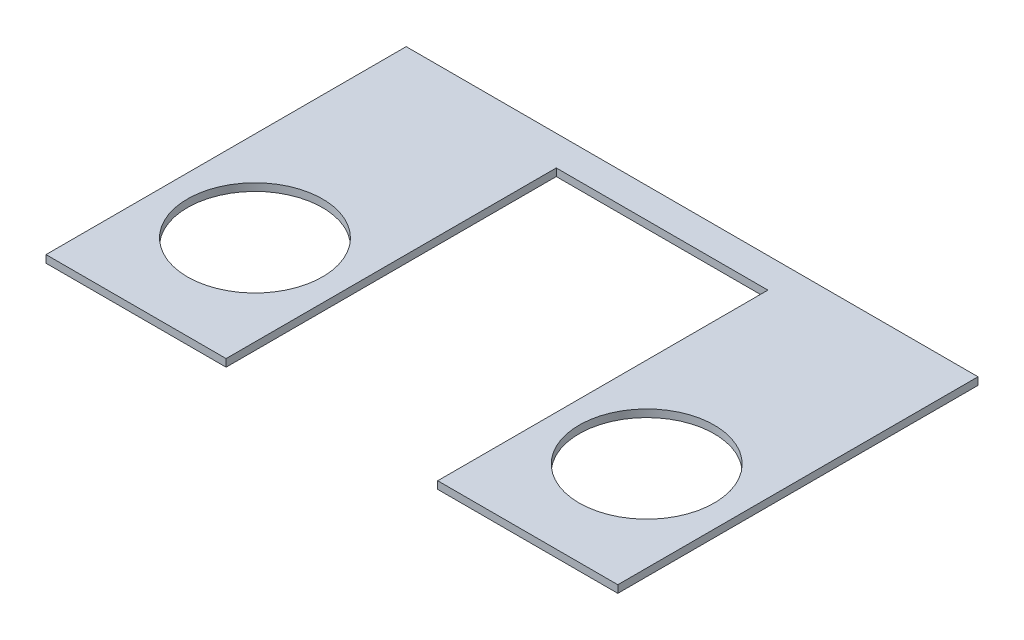
ISO-10303-21;
HEADER;
FILE_DESCRIPTION(('STEP AP214'),'2;1');
FILE_NAME('part.step','',(''),(''),'','','');
FILE_SCHEMA(('AUTOMOTIVE_DESIGN { 1 0 10303 214 1 1 1 1 }'));
ENDSEC;
DATA;
#1=APPLICATION_CONTEXT('core data for automotive mechanical design processes');
#2=APPLICATION_PROTOCOL_DEFINITION('international standard','automotive_design',2000,#1);
#3=PRODUCT_CONTEXT('',#1,'mechanical');
#4=PRODUCT('Part','Part','',(#3));
#5=PRODUCT_RELATED_PRODUCT_CATEGORY('part','',(#4));
#6=PRODUCT_DEFINITION_FORMATION('','',#4);
#7=PRODUCT_DEFINITION_CONTEXT('part definition',#1,'design');
#8=PRODUCT_DEFINITION('design','',#6,#7);
#9=PRODUCT_DEFINITION_SHAPE('','',#8);
#10=(LENGTH_UNIT() NAMED_UNIT(*) SI_UNIT(.MILLI.,.METRE.));
#11=(NAMED_UNIT(*) PLANE_ANGLE_UNIT() SI_UNIT($,.RADIAN.));
#12=(NAMED_UNIT(*) SI_UNIT($,.STERADIAN.) SOLID_ANGLE_UNIT());
#13=UNCERTAINTY_MEASURE_WITH_UNIT(LENGTH_MEASURE(1.E-05),#10,'distance_accuracy_value','');
#14=(GEOMETRIC_REPRESENTATION_CONTEXT(3) GLOBAL_UNCERTAINTY_ASSIGNED_CONTEXT((#13)) GLOBAL_UNIT_ASSIGNED_CONTEXT((#10,
#11,#12)) REPRESENTATION_CONTEXT('',''));
#15=CARTESIAN_POINT('',(0.,0.,0.));
#16=DIRECTION('',(0.,0.,1.));
#17=DIRECTION('',(1.,0.,0.));
#18=AXIS2_PLACEMENT_3D('',#15,#16,#17);
#19=CARTESIAN_POINT('',(-200.,5.,120.));
#20=DIRECTION('',(0.,0.,-1.));
#21=DIRECTION('',(-1.,0.,0.));
#22=AXIS2_PLACEMENT_3D('',#19,#20,#21);
#23=PLANE('',#22);
#24=DIRECTION('',(1.,0.,0.));
#25=VECTOR('',#24,1.);
#26=CARTESIAN_POINT('',(-200.,5.,120.));
#27=LINE('',#26,#25);
#28=CARTESIAN_POINT('',(61.,5.,120.));
#29=VERTEX_POINT('',#28);
#30=CARTESIAN_POINT('',(181.,5.,120.));
#31=VERTEX_POINT('',#30);
#32=EDGE_CURVE('E180',#29,#31,#27,.T.);
#33=ORIENTED_EDGE('',*,*,#32,.F.);
#34=DIRECTION('',(0.,1.,0.));
#35=VECTOR('',#34,1.);
#36=CARTESIAN_POINT('',(61.,0.,120.));
#37=LINE('',#36,#35);
#38=CARTESIAN_POINT('',(61.,0.,120.));
#39=VERTEX_POINT('',#38);
#40=EDGE_CURVE('E152',#39,#29,#37,.T.);
#41=ORIENTED_EDGE('',*,*,#40,.F.);
#42=DIRECTION('',(1.,0.,0.));
#43=VECTOR('',#42,1.);
#44=CARTESIAN_POINT('',(-200.,0.,120.));
#45=LINE('',#44,#43);
#46=CARTESIAN_POINT('',(181.,0.,120.));
#47=VERTEX_POINT('',#46);
#48=EDGE_CURVE('E138',#39,#47,#45,.T.);
#49=ORIENTED_EDGE('',*,*,#48,.T.);
#50=DIRECTION('',(0.,-1.,0.));
#51=VECTOR('',#50,1.);
#52=CARTESIAN_POINT('',(181.,5.,120.));
#53=LINE('',#52,#51);
#54=EDGE_CURVE('E48',#31,#47,#53,.T.);
#55=ORIENTED_EDGE('',*,*,#54,.F.);
#56=EDGE_LOOP('',(#33,#41,#49,#55));
#57=FACE_BOUND('',#56,.T.);
#58=ADVANCED_FACE('F39',(#57),#23,.F.);
#59=CARTESIAN_POINT('',(-200.,5.,-120.));
#60=DIRECTION('',(1.,0.,0.));
#61=DIRECTION('',(0.,0.,-1.));
#62=AXIS2_PLACEMENT_3D('',#59,#60,#61);
#63=PLANE('',#62);
#64=DIRECTION('',(0.,0.,1.));
#65=VECTOR('',#64,1.);
#66=CARTESIAN_POINT('',(-200.,0.,-120.));
#67=LINE('',#66,#65);
#68=CARTESIAN_POINT('',(-200.,0.,-120.));
#69=VERTEX_POINT('',#68);
#70=CARTESIAN_POINT('',(-200.,0.,120.));
#71=VERTEX_POINT('',#70);
#72=EDGE_CURVE('E165',#69,#71,#67,.T.);
#73=ORIENTED_EDGE('',*,*,#72,.T.);
#74=DIRECTION('',(0.,-1.,0.));
#75=VECTOR('',#74,1.);
#76=CARTESIAN_POINT('',(-200.,5.,120.));
#77=LINE('',#76,#75);
#78=CARTESIAN_POINT('',(-200.,5.,120.));
#79=VERTEX_POINT('',#78);
#80=EDGE_CURVE('E11',#79,#71,#77,.T.);
#81=ORIENTED_EDGE('',*,*,#80,.F.);
#82=DIRECTION('',(0.,0.,1.));
#83=VECTOR('',#82,1.);
#84=CARTESIAN_POINT('',(-200.,5.,-120.));
#85=LINE('',#84,#83);
#86=CARTESIAN_POINT('',(-200.,5.,-120.));
#87=VERTEX_POINT('',#86);
#88=EDGE_CURVE('E177',#87,#79,#85,.T.);
#89=ORIENTED_EDGE('',*,*,#88,.F.);
#90=DIRECTION('',(0.,-1.,0.));
#91=VECTOR('',#90,1.);
#92=CARTESIAN_POINT('',(-200.,5.,-120.));
#93=LINE('',#92,#91);
#94=EDGE_CURVE('E188',#87,#69,#93,.T.);
#95=ORIENTED_EDGE('',*,*,#94,.T.);
#96=EDGE_LOOP('',(#73,#81,#89,#95));
#97=FACE_BOUND('',#96,.T.);
#98=ADVANCED_FACE('F41',(#97),#63,.F.);
#99=CARTESIAN_POINT('',(-80.,0.,120.));
#100=VERTEX_POINT('',#99);
#101=EDGE_CURVE('E192',#71,#100,#45,.T.);
#102=ORIENTED_EDGE('',*,*,#101,.T.);
#103=DIRECTION('',(0.,1.,0.));
#104=VECTOR('',#103,1.);
#105=CARTESIAN_POINT('',(-80.,0.,120.));
#106=LINE('',#105,#104);
#107=CARTESIAN_POINT('',(-80.,5.,120.));
#108=VERTEX_POINT('',#107);
#109=EDGE_CURVE('E156',#100,#108,#106,.T.);
#110=ORIENTED_EDGE('',*,*,#109,.T.);
#111=EDGE_CURVE('E92',#79,#108,#27,.T.);
#112=ORIENTED_EDGE('',*,*,#111,.F.);
#113=ORIENTED_EDGE('',*,*,#80,.T.);
#114=EDGE_LOOP('',(#102,#110,#112,#113));
#115=FACE_BOUND('',#114,.T.);
#116=ADVANCED_FACE('F227',(#115),#23,.F.);
#117=CARTESIAN_POINT('',(181.,5.,-120.));
#118=DIRECTION('',(-1.,0.,0.));
#119=DIRECTION('',(0.,0.,1.));
#120=AXIS2_PLACEMENT_3D('',#117,#118,#119);
#121=PLANE('',#120);
#122=DIRECTION('',(0.,0.,-1.));
#123=VECTOR('',#122,1.);
#124=CARTESIAN_POINT('',(181.,0.,-120.));
#125=LINE('',#124,#123);
#126=CARTESIAN_POINT('',(181.,0.,-120.));
#127=VERTEX_POINT('',#126);
#128=EDGE_CURVE('E196',#47,#127,#125,.T.);
#129=ORIENTED_EDGE('',*,*,#128,.T.);
#130=DIRECTION('',(0.,-1.,0.));
#131=VECTOR('',#130,1.);
#132=CARTESIAN_POINT('',(181.,5.,-120.));
#133=LINE('',#132,#131);
#134=CARTESIAN_POINT('',(181.,5.,-120.));
#135=VERTEX_POINT('',#134);
#136=EDGE_CURVE('E203',#135,#127,#133,.T.);
#137=ORIENTED_EDGE('',*,*,#136,.F.);
#138=DIRECTION('',(0.,0.,-1.));
#139=VECTOR('',#138,1.);
#140=CARTESIAN_POINT('',(181.,5.,-120.));
#141=LINE('',#140,#139);
#142=EDGE_CURVE('E183',#31,#135,#141,.T.);
#143=ORIENTED_EDGE('',*,*,#142,.F.);
#144=ORIENTED_EDGE('',*,*,#54,.T.);
#145=EDGE_LOOP('',(#129,#137,#143,#144));
#146=FACE_BOUND('',#145,.T.);
#147=ADVANCED_FACE('F210',(#146),#121,.F.);
#148=CARTESIAN_POINT('',(-200.,5.,-120.));
#149=DIRECTION('',(0.,0.,1.));
#150=DIRECTION('',(1.,0.,0.));
#151=AXIS2_PLACEMENT_3D('',#148,#149,#150);
#152=PLANE('',#151);
#153=DIRECTION('',(-1.,0.,0.));
#154=VECTOR('',#153,1.);
#155=CARTESIAN_POINT('',(-200.,0.,-120.));
#156=LINE('',#155,#154);
#157=EDGE_CURVE('E85',#127,#69,#156,.T.);
#158=ORIENTED_EDGE('',*,*,#157,.T.);
#159=ORIENTED_EDGE('',*,*,#94,.F.);
#160=DIRECTION('',(-1.,0.,0.));
#161=VECTOR('',#160,1.);
#162=CARTESIAN_POINT('',(-200.,5.,-120.));
#163=LINE('',#162,#161);
#164=EDGE_CURVE('E64',#135,#87,#163,.T.);
#165=ORIENTED_EDGE('',*,*,#164,.F.);
#166=ORIENTED_EDGE('',*,*,#136,.T.);
#167=EDGE_LOOP('',(#158,#159,#165,#166));
#168=FACE_BOUND('',#167,.T.);
#169=ADVANCED_FACE('F218',(#168),#152,.F.);
#170=CARTESIAN_POINT('',(0.,5.,0.));
#171=DIRECTION('',(0.,1.,0.));
#172=DIRECTION('',(0.,0.,1.));
#173=AXIS2_PLACEMENT_3D('',#170,#171,#172);
#174=PLANE('',#173);
#175=DIRECTION('',(0.,0.,-1.));
#176=VECTOR('',#175,1.);
#177=CARTESIAN_POINT('',(61.,5.,120.));
#178=LINE('',#177,#176);
#179=CARTESIAN_POINT('',(61.,5.,-100.));
#180=VERTEX_POINT('',#179);
#181=EDGE_CURVE('E121',#29,#180,#178,.T.);
#182=ORIENTED_EDGE('',*,*,#181,.F.);
#183=ORIENTED_EDGE('',*,*,#32,.T.);
#184=ORIENTED_EDGE('',*,*,#142,.T.);
#185=ORIENTED_EDGE('',*,*,#164,.T.);
#186=ORIENTED_EDGE('',*,*,#88,.T.);
#187=ORIENTED_EDGE('',*,*,#111,.T.);
#188=DIRECTION('',(0.,0.,1.));
#189=VECTOR('',#188,1.);
#190=CARTESIAN_POINT('',(-80.,5.,120.));
#191=LINE('',#190,#189);
#192=CARTESIAN_POINT('',(-80.,5.,-100.));
#193=VERTEX_POINT('',#192);
#194=EDGE_CURVE('E140',#193,#108,#191,.T.);
#195=ORIENTED_EDGE('',*,*,#194,.F.);
#196=DIRECTION('',(-1.,0.,0.));
#197=VECTOR('',#196,1.);
#198=CARTESIAN_POINT('',(61.,5.,-100.));
#199=LINE('',#198,#197);
#200=EDGE_CURVE('E143',#180,#193,#199,.T.);
#201=ORIENTED_EDGE('',*,*,#200,.F.);
#202=EDGE_LOOP('',(#182,#183,#184,#185,#186,#187,#195,#201));
#203=FACE_BOUND('',#202,.T.);
#204=CARTESIAN_POINT('',(-140.,5.,40.7500000000001));
#205=DIRECTION('',(0.,1.,0.));
#206=DIRECTION('',(0.,0.,1.));
#207=AXIS2_PLACEMENT_3D('',#204,#205,#206);
#208=CIRCLE('',#207,45.);
#209=CARTESIAN_POINT('',(-140.,5.,85.75));
#210=VERTEX_POINT('',#209);
#211=EDGE_CURVE('E166',#210,#210,#208,.T.);
#212=ORIENTED_EDGE('',*,*,#211,.F.);
#213=EDGE_LOOP('',(#212));
#214=FACE_BOUND('',#213,.T.);
#215=CARTESIAN_POINT('',(121.,5.,40.75));
#216=DIRECTION('',(0.,1.,0.));
#217=DIRECTION('',(0.,0.,1.));
#218=AXIS2_PLACEMENT_3D('',#215,#216,#217);
#219=CIRCLE('',#218,45.);
#220=CARTESIAN_POINT('',(121.,5.,85.75));
#221=VERTEX_POINT('',#220);
#222=EDGE_CURVE('E155',#221,#221,#219,.T.);
#223=ORIENTED_EDGE('',*,*,#222,.F.);
#224=EDGE_LOOP('',(#223));
#225=FACE_BOUND('',#224,.T.);
#226=ADVANCED_FACE('F220',(#203,#214,#225),#174,.T.);
#227=CARTESIAN_POINT('',(0.,0.,0.));
#228=DIRECTION('',(0.,1.,0.));
#229=DIRECTION('',(0.,0.,1.));
#230=AXIS2_PLACEMENT_3D('',#227,#228,#229);
#231=PLANE('',#230);
#232=ORIENTED_EDGE('',*,*,#48,.F.);
#233=DIRECTION('',(0.,0.,-1.));
#234=VECTOR('',#233,1.);
#235=CARTESIAN_POINT('',(61.,0.,120.));
#236=LINE('',#235,#234);
#237=CARTESIAN_POINT('',(61.,0.,-100.));
#238=VERTEX_POINT('',#237);
#239=EDGE_CURVE('E118',#39,#238,#236,.T.);
#240=ORIENTED_EDGE('',*,*,#239,.T.);
#241=DIRECTION('',(-1.,0.,0.));
#242=VECTOR('',#241,1.);
#243=CARTESIAN_POINT('',(61.,0.,-100.));
#244=LINE('',#243,#242);
#245=CARTESIAN_POINT('',(-80.,0.,-100.));
#246=VERTEX_POINT('',#245);
#247=EDGE_CURVE('E129',#238,#246,#244,.T.);
#248=ORIENTED_EDGE('',*,*,#247,.T.);
#249=DIRECTION('',(0.,0.,1.));
#250=VECTOR('',#249,1.);
#251=CARTESIAN_POINT('',(-80.,0.,120.));
#252=LINE('',#251,#250);
#253=EDGE_CURVE('E55',#246,#100,#252,.T.);
#254=ORIENTED_EDGE('',*,*,#253,.T.);
#255=ORIENTED_EDGE('',*,*,#101,.F.);
#256=ORIENTED_EDGE('',*,*,#72,.F.);
#257=ORIENTED_EDGE('',*,*,#157,.F.);
#258=ORIENTED_EDGE('',*,*,#128,.F.);
#259=EDGE_LOOP('',(#232,#240,#248,#254,#255,#256,#257,#258));
#260=FACE_BOUND('',#259,.T.);
#261=CARTESIAN_POINT('',(-140.,0.,40.7500000000001));
#262=DIRECTION('',(0.,1.,0.));
#263=DIRECTION('',(0.,0.,1.));
#264=AXIS2_PLACEMENT_3D('',#261,#262,#263);
#265=CIRCLE('',#264,45.);
#266=CARTESIAN_POINT('',(-140.,0.,85.75));
#267=VERTEX_POINT('',#266);
#268=EDGE_CURVE('E161',#267,#267,#265,.T.);
#269=ORIENTED_EDGE('',*,*,#268,.T.);
#270=EDGE_LOOP('',(#269));
#271=FACE_BOUND('',#270,.T.);
#272=CARTESIAN_POINT('',(121.,0.,40.75));
#273=DIRECTION('',(0.,1.,0.));
#274=DIRECTION('',(0.,0.,1.));
#275=AXIS2_PLACEMENT_3D('',#272,#273,#274);
#276=CIRCLE('',#275,45.);
#277=CARTESIAN_POINT('',(121.,0.,85.75));
#278=VERTEX_POINT('',#277);
#279=EDGE_CURVE('E170',#278,#278,#276,.T.);
#280=ORIENTED_EDGE('',*,*,#279,.T.);
#281=EDGE_LOOP('',(#280));
#282=FACE_BOUND('',#281,.T.);
#283=ADVANCED_FACE('F135',(#260,#271,#282),#231,.F.);
#284=CARTESIAN_POINT('',(121.,0.,40.75));
#285=DIRECTION('',(0.,1.,0.));
#286=DIRECTION('',(0.,0.,1.));
#287=AXIS2_PLACEMENT_3D('',#284,#285,#286);
#288=CYLINDRICAL_SURFACE('',#287,45.);
#289=ORIENTED_EDGE('',*,*,#279,.F.);
#290=EDGE_LOOP('',(#289));
#291=FACE_BOUND('',#290,.T.);
#292=ORIENTED_EDGE('',*,*,#222,.T.);
#293=EDGE_LOOP('',(#292));
#294=FACE_BOUND('',#293,.T.);
#295=ADVANCED_FACE('F252',(#291,#294),#288,.F.);
#296=CARTESIAN_POINT('',(-140.,0.,40.7500000000001));
#297=DIRECTION('',(0.,1.,0.));
#298=DIRECTION('',(0.,0.,1.));
#299=AXIS2_PLACEMENT_3D('',#296,#297,#298);
#300=CYLINDRICAL_SURFACE('',#299,45.);
#301=ORIENTED_EDGE('',*,*,#268,.F.);
#302=EDGE_LOOP('',(#301));
#303=FACE_BOUND('',#302,.T.);
#304=ORIENTED_EDGE('',*,*,#211,.T.);
#305=EDGE_LOOP('',(#304));
#306=FACE_BOUND('',#305,.T.);
#307=ADVANCED_FACE('F247',(#303,#306),#300,.F.);
#308=CARTESIAN_POINT('',(61.,0.,120.));
#309=DIRECTION('',(1.,0.,0.));
#310=DIRECTION('',(0.,0.,-1.));
#311=AXIS2_PLACEMENT_3D('',#308,#309,#310);
#312=PLANE('',#311);
#313=ORIENTED_EDGE('',*,*,#181,.T.);
#314=DIRECTION('',(0.,1.,0.));
#315=VECTOR('',#314,1.);
#316=CARTESIAN_POINT('',(61.,0.,-100.));
#317=LINE('',#316,#315);
#318=EDGE_CURVE('E114',#238,#180,#317,.T.);
#319=ORIENTED_EDGE('',*,*,#318,.F.);
#320=ORIENTED_EDGE('',*,*,#239,.F.);
#321=ORIENTED_EDGE('',*,*,#40,.T.);
#322=EDGE_LOOP('',(#313,#319,#320,#321));
#323=FACE_BOUND('',#322,.T.);
#324=ADVANCED_FACE('F116',(#323),#312,.F.);
#325=CARTESIAN_POINT('',(-80.,0.,120.));
#326=DIRECTION('',(-1.,0.,0.));
#327=DIRECTION('',(0.,0.,1.));
#328=AXIS2_PLACEMENT_3D('',#325,#326,#327);
#329=PLANE('',#328);
#330=ORIENTED_EDGE('',*,*,#194,.T.);
#331=ORIENTED_EDGE('',*,*,#109,.F.);
#332=ORIENTED_EDGE('',*,*,#253,.F.);
#333=DIRECTION('',(0.,1.,0.));
#334=VECTOR('',#333,1.);
#335=CARTESIAN_POINT('',(-80.,0.,-100.));
#336=LINE('',#335,#334);
#337=EDGE_CURVE('E126',#246,#193,#336,.T.);
#338=ORIENTED_EDGE('',*,*,#337,.T.);
#339=EDGE_LOOP('',(#330,#331,#332,#338));
#340=FACE_BOUND('',#339,.T.);
#341=ADVANCED_FACE('F239',(#340),#329,.F.);
#342=CARTESIAN_POINT('',(61.,0.,-100.));
#343=DIRECTION('',(0.,0.,-1.));
#344=DIRECTION('',(-1.,0.,0.));
#345=AXIS2_PLACEMENT_3D('',#342,#343,#344);
#346=PLANE('',#345);
#347=ORIENTED_EDGE('',*,*,#200,.T.);
#348=ORIENTED_EDGE('',*,*,#337,.F.);
#349=ORIENTED_EDGE('',*,*,#247,.F.);
#350=ORIENTED_EDGE('',*,*,#318,.T.);
#351=EDGE_LOOP('',(#347,#348,#349,#350));
#352=FACE_BOUND('',#351,.T.);
#353=ADVANCED_FACE('F130',(#352),#346,.F.);
#354=CLOSED_SHELL('',(#58,#98,#116,#147,#169,#226,#283,#295,#307,#324,#341,#353));
#355=MANIFOLD_SOLID_BREP('B2',#354);
#356=ADVANCED_BREP_SHAPE_REPRESENTATION('',(#18,#355),#14);
#357=SHAPE_DEFINITION_REPRESENTATION(#9,#356);
ENDSEC;
END-ISO-10303-21;
